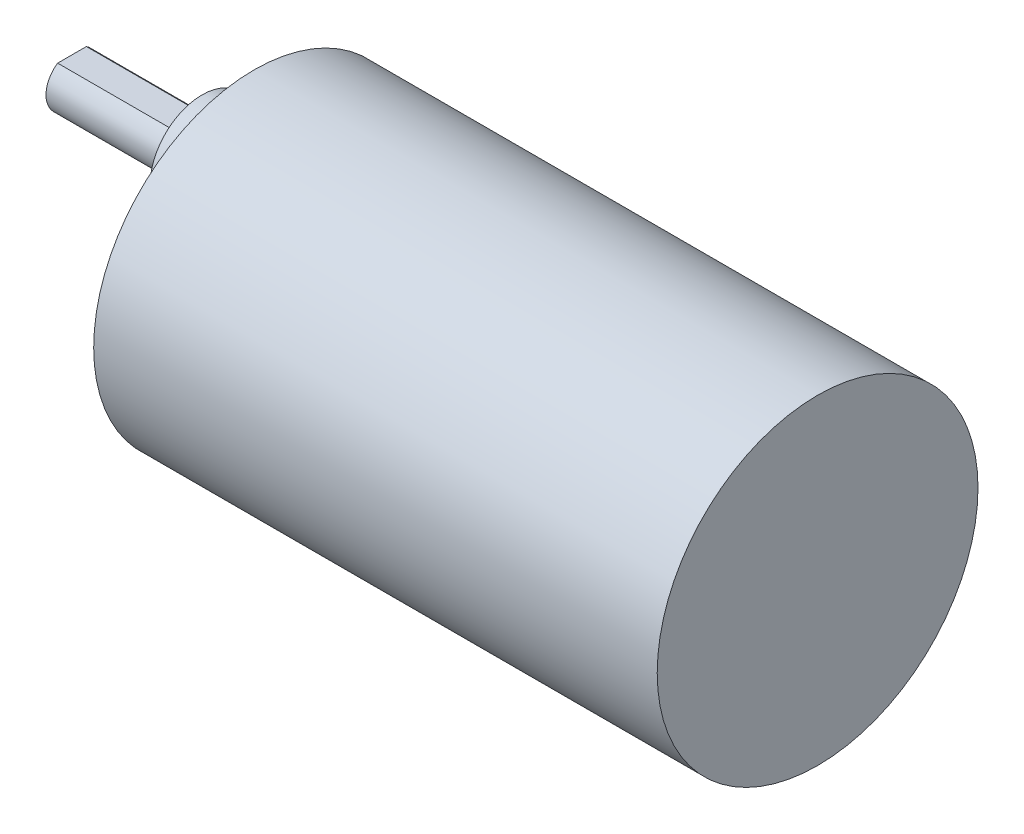
ISO-10303-21;
HEADER;
FILE_DESCRIPTION(('STEP AP214'),'2;1');
FILE_NAME('part.step','',(''),(''),'','','');
FILE_SCHEMA(('AUTOMOTIVE_DESIGN { 1 0 10303 214 1 1 1 1 }'));
ENDSEC;
DATA;
#1=APPLICATION_CONTEXT('core data for automotive mechanical design processes');
#2=APPLICATION_PROTOCOL_DEFINITION('international standard','automotive_design',2000,#1);
#3=PRODUCT_CONTEXT('',#1,'mechanical');
#4=PRODUCT('Part','Part','',(#3));
#5=PRODUCT_RELATED_PRODUCT_CATEGORY('part','',(#4));
#6=PRODUCT_DEFINITION_FORMATION('','',#4);
#7=PRODUCT_DEFINITION_CONTEXT('part definition',#1,'design');
#8=PRODUCT_DEFINITION('design','',#6,#7);
#9=PRODUCT_DEFINITION_SHAPE('','',#8);
#10=(LENGTH_UNIT() NAMED_UNIT(*) SI_UNIT(.MILLI.,.METRE.));
#11=(NAMED_UNIT(*) PLANE_ANGLE_UNIT() SI_UNIT($,.RADIAN.));
#12=(NAMED_UNIT(*) SI_UNIT($,.STERADIAN.) SOLID_ANGLE_UNIT());
#13=UNCERTAINTY_MEASURE_WITH_UNIT(LENGTH_MEASURE(1.E-05),#10,'distance_accuracy_value','');
#14=(GEOMETRIC_REPRESENTATION_CONTEXT(3) GLOBAL_UNCERTAINTY_ASSIGNED_CONTEXT((#13)) GLOBAL_UNIT_ASSIGNED_CONTEXT((#10,
#11,#12)) REPRESENTATION_CONTEXT('',''));
#15=CARTESIAN_POINT('',(0.,0.,0.));
#16=DIRECTION('',(0.,0.,1.));
#17=DIRECTION('',(1.,0.,0.));
#18=AXIS2_PLACEMENT_3D('',#15,#16,#17);
#19=CARTESIAN_POINT('',(65.,0.,0.));
#20=DIRECTION('',(-1.,0.,0.));
#21=DIRECTION('',(0.,0.,1.));
#22=AXIS2_PLACEMENT_3D('',#19,#20,#21);
#23=CYLINDRICAL_SURFACE('',#22,18.5);
#24=CARTESIAN_POINT('',(65.,0.,0.));
#25=DIRECTION('',(1.,0.,0.));
#26=DIRECTION('',(0.,0.,-1.));
#27=AXIS2_PLACEMENT_3D('',#24,#25,#26);
#28=CIRCLE('',#27,18.5);
#29=CARTESIAN_POINT('',(65.,0.,-18.5));
#30=VERTEX_POINT('',#29);
#31=EDGE_CURVE('E52',#30,#30,#28,.T.);
#32=ORIENTED_EDGE('',*,*,#31,.F.);
#33=EDGE_LOOP('',(#32));
#34=FACE_BOUND('',#33,.T.);
#35=CARTESIAN_POINT('',(0.,0.,0.));
#36=DIRECTION('',(1.,0.,0.));
#37=DIRECTION('',(0.,0.,-1.));
#38=AXIS2_PLACEMENT_3D('',#35,#36,#37);
#39=CIRCLE('',#38,18.5);
#40=CARTESIAN_POINT('',(0.,0.,-18.5));
#41=VERTEX_POINT('',#40);
#42=EDGE_CURVE('E103',#41,#41,#39,.T.);
#43=ORIENTED_EDGE('',*,*,#42,.T.);
#44=EDGE_LOOP('',(#43));
#45=FACE_BOUND('',#44,.T.);
#46=ADVANCED_FACE('F44',(#34,#45),#23,.T.);
#47=CARTESIAN_POINT('',(65.,0.,0.));
#48=DIRECTION('',(1.,0.,0.));
#49=DIRECTION('',(0.,0.,-1.));
#50=AXIS2_PLACEMENT_3D('',#47,#48,#49);
#51=PLANE('',#50);
#52=ORIENTED_EDGE('',*,*,#31,.T.);
#53=EDGE_LOOP('',(#52));
#54=FACE_BOUND('',#53,.T.);
#55=ADVANCED_FACE('F114',(#54),#51,.T.);
#56=CARTESIAN_POINT('',(0.,0.,0.));
#57=DIRECTION('',(1.,0.,0.));
#58=DIRECTION('',(0.,0.,-1.));
#59=AXIS2_PLACEMENT_3D('',#56,#57,#58);
#60=PLANE('',#59);
#61=CARTESIAN_POINT('',(0.,7.,0.));
#62=DIRECTION('',(1.,0.,0.));
#63=DIRECTION('',(0.,0.,-1.));
#64=AXIS2_PLACEMENT_3D('',#61,#62,#63);
#65=CIRCLE('',#64,6.);
#66=CARTESIAN_POINT('',(0.,7.,-6.));
#67=VERTEX_POINT('',#66);
#68=EDGE_CURVE('E11',#67,#67,#65,.F.);
#69=ORIENTED_EDGE('',*,*,#68,.F.);
#70=EDGE_LOOP('',(#69));
#71=FACE_BOUND('',#70,.T.);
#72=ORIENTED_EDGE('',*,*,#42,.F.);
#73=EDGE_LOOP('',(#72));
#74=FACE_BOUND('',#73,.T.);
#75=ADVANCED_FACE('F111',(#71,#74),#60,.F.);
#76=CARTESIAN_POINT('',(-6.,7.,0.));
#77=DIRECTION('',(1.,0.,0.));
#78=DIRECTION('',(0.,0.,-1.));
#79=AXIS2_PLACEMENT_3D('',#76,#77,#78);
#80=CYLINDRICAL_SURFACE('',#79,6.);
#81=CARTESIAN_POINT('',(-6.,7.,0.));
#82=DIRECTION('',(-1.,0.,0.));
#83=DIRECTION('',(0.,0.,1.));
#84=AXIS2_PLACEMENT_3D('',#81,#82,#83);
#85=CIRCLE('',#84,6.);
#86=CARTESIAN_POINT('',(-6.,7.,6.));
#87=VERTEX_POINT('',#86);
#88=EDGE_CURVE('E96',#87,#87,#85,.T.);
#89=ORIENTED_EDGE('',*,*,#88,.F.);
#90=EDGE_LOOP('',(#89));
#91=FACE_BOUND('',#90,.T.);
#92=ORIENTED_EDGE('',*,*,#68,.T.);
#93=EDGE_LOOP('',(#92));
#94=FACE_BOUND('',#93,.T.);
#95=ADVANCED_FACE('F113',(#91,#94),#80,.T.);
#96=CARTESIAN_POINT('',(-6.,7.,0.));
#97=DIRECTION('',(-1.,0.,0.));
#98=DIRECTION('',(0.,0.,1.));
#99=AXIS2_PLACEMENT_3D('',#96,#97,#98);
#100=PLANE('',#99);
#101=CARTESIAN_POINT('',(-6.,7.,0.));
#102=DIRECTION('',(-1.,0.,0.));
#103=DIRECTION('',(0.,0.,1.));
#104=AXIS2_PLACEMENT_3D('',#101,#102,#103);
#105=CIRCLE('',#104,3.);
#106=CARTESIAN_POINT('',(-6.,9.5,-1.6583123951777));
#107=VERTEX_POINT('',#106);
#108=CARTESIAN_POINT('',(-6.,9.5,1.6583123951777));
#109=VERTEX_POINT('',#108);
#110=EDGE_CURVE('E75',#107,#109,#105,.T.);
#111=ORIENTED_EDGE('',*,*,#110,.F.);
#112=DIRECTION('',(0.,0.,-1.));
#113=VECTOR('',#112,1.);
#114=CARTESIAN_POINT('',(-6.,9.5,-1.6583123951777));
#115=LINE('',#114,#113);
#116=EDGE_CURVE('E61',#109,#107,#115,.T.);
#117=ORIENTED_EDGE('',*,*,#116,.F.);
#118=EDGE_LOOP('',(#111,#117));
#119=FACE_BOUND('',#118,.T.);
#120=ORIENTED_EDGE('',*,*,#88,.T.);
#121=EDGE_LOOP('',(#120));
#122=FACE_BOUND('',#121,.T.);
#123=ADVANCED_FACE('F76',(#119,#122),#100,.T.);
#124=CARTESIAN_POINT('',(-21.,7.,0.));
#125=DIRECTION('',(1.,0.,0.));
#126=DIRECTION('',(0.,0.,-1.));
#127=AXIS2_PLACEMENT_3D('',#124,#125,#126);
#128=CYLINDRICAL_SURFACE('',#127,3.);
#129=ORIENTED_EDGE('',*,*,#110,.T.);
#130=DIRECTION('',(1.,0.,0.));
#131=VECTOR('',#130,1.);
#132=CARTESIAN_POINT('',(-21.,9.5,1.6583123951777));
#133=LINE('',#132,#131);
#134=CARTESIAN_POINT('',(-21.,9.5,1.6583123951777));
#135=VERTEX_POINT('',#134);
#136=EDGE_CURVE('E87',#135,#109,#133,.T.);
#137=ORIENTED_EDGE('',*,*,#136,.F.);
#138=CARTESIAN_POINT('',(-21.,7.,0.));
#139=DIRECTION('',(-1.,0.,0.));
#140=DIRECTION('',(0.,0.,1.));
#141=AXIS2_PLACEMENT_3D('',#138,#139,#140);
#142=CIRCLE('',#141,3.);
#143=CARTESIAN_POINT('',(-21.,9.5,-1.6583123951777));
#144=VERTEX_POINT('',#143);
#145=EDGE_CURVE('E89',#144,#135,#142,.T.);
#146=ORIENTED_EDGE('',*,*,#145,.F.);
#147=DIRECTION('',(1.,0.,0.));
#148=VECTOR('',#147,1.);
#149=CARTESIAN_POINT('',(-21.,9.5,-1.6583123951777));
#150=LINE('',#149,#148);
#151=EDGE_CURVE('E85',#144,#107,#150,.T.);
#152=ORIENTED_EDGE('',*,*,#151,.T.);
#153=EDGE_LOOP('',(#129,#137,#146,#152));
#154=FACE_BOUND('',#153,.T.);
#155=ADVANCED_FACE('F91',(#154),#128,.T.);
#156=CARTESIAN_POINT('',(-21.,9.5,-1.6583123951777));
#157=DIRECTION('',(0.,-1.,0.));
#158=DIRECTION('',(0.,0.,-1.));
#159=AXIS2_PLACEMENT_3D('',#156,#157,#158);
#160=PLANE('',#159);
#161=ORIENTED_EDGE('',*,*,#116,.T.);
#162=ORIENTED_EDGE('',*,*,#151,.F.);
#163=DIRECTION('',(0.,0.,-1.));
#164=VECTOR('',#163,1.);
#165=CARTESIAN_POINT('',(-21.,9.5,-1.6583123951777));
#166=LINE('',#165,#164);
#167=EDGE_CURVE('E70',#135,#144,#166,.T.);
#168=ORIENTED_EDGE('',*,*,#167,.F.);
#169=ORIENTED_EDGE('',*,*,#136,.T.);
#170=EDGE_LOOP('',(#161,#162,#168,#169));
#171=FACE_BOUND('',#170,.T.);
#172=ADVANCED_FACE('F84',(#171),#160,.F.);
#173=CARTESIAN_POINT('',(-21.,7.,0.));
#174=DIRECTION('',(-1.,0.,0.));
#175=DIRECTION('',(0.,0.,1.));
#176=AXIS2_PLACEMENT_3D('',#173,#174,#175);
#177=PLANE('',#176);
#178=ORIENTED_EDGE('',*,*,#145,.T.);
#179=ORIENTED_EDGE('',*,*,#167,.T.);
#180=EDGE_LOOP('',(#178,#179));
#181=FACE_BOUND('',#180,.T.);
#182=ADVANCED_FACE('F168',(#181),#177,.T.);
#183=CLOSED_SHELL('',(#46,#55,#75,#95,#123,#155,#172,#182));
#184=MANIFOLD_SOLID_BREP('B2',#183);
#185=ADVANCED_BREP_SHAPE_REPRESENTATION('',(#18,#184),#14);
#186=SHAPE_DEFINITION_REPRESENTATION(#9,#185);
ENDSEC;
END-ISO-10303-21;
